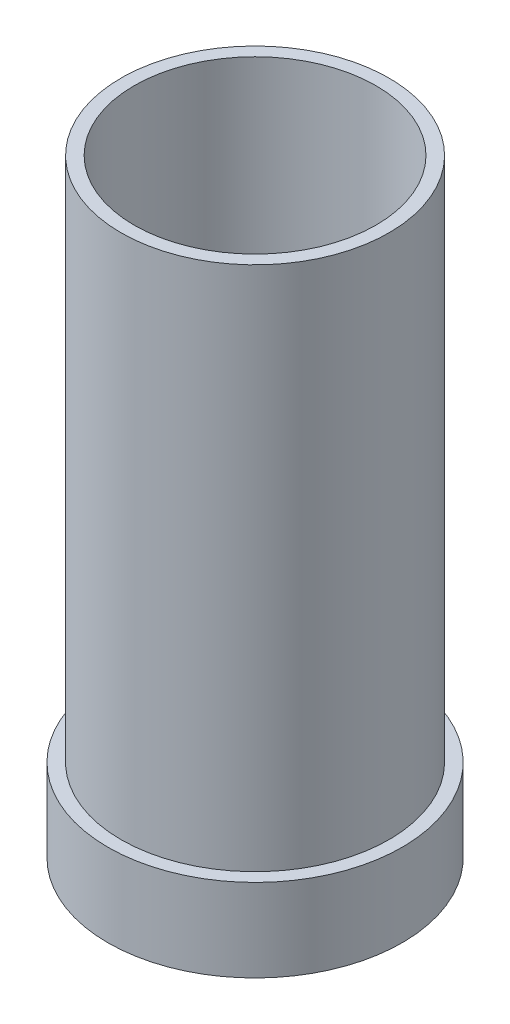
ISO-10303-21;
HEADER;
FILE_DESCRIPTION(('STEP AP214'),'2;1');
FILE_NAME('part.step','',(''),(''),'','','');
FILE_SCHEMA(('AUTOMOTIVE_DESIGN { 1 0 10303 214 1 1 1 1 }'));
ENDSEC;
DATA;
#1=APPLICATION_CONTEXT('core data for automotive mechanical design processes');
#2=APPLICATION_PROTOCOL_DEFINITION('international standard','automotive_design',2000,#1);
#3=PRODUCT_CONTEXT('',#1,'mechanical');
#4=PRODUCT('Part','Part','',(#3));
#5=PRODUCT_RELATED_PRODUCT_CATEGORY('part','',(#4));
#6=PRODUCT_DEFINITION_FORMATION('','',#4);
#7=PRODUCT_DEFINITION_CONTEXT('part definition',#1,'design');
#8=PRODUCT_DEFINITION('design','',#6,#7);
#9=PRODUCT_DEFINITION_SHAPE('','',#8);
#10=(LENGTH_UNIT() NAMED_UNIT(*) SI_UNIT(.MILLI.,.METRE.));
#11=(NAMED_UNIT(*) PLANE_ANGLE_UNIT() SI_UNIT($,.RADIAN.));
#12=(NAMED_UNIT(*) SI_UNIT($,.STERADIAN.) SOLID_ANGLE_UNIT());
#13=UNCERTAINTY_MEASURE_WITH_UNIT(LENGTH_MEASURE(1.E-05),#10,'distance_accuracy_value','');
#14=(GEOMETRIC_REPRESENTATION_CONTEXT(3) GLOBAL_UNCERTAINTY_ASSIGNED_CONTEXT((#13)) GLOBAL_UNIT_ASSIGNED_CONTEXT((#10,
#11,#12)) REPRESENTATION_CONTEXT('',''));
#15=CARTESIAN_POINT('',(0.,0.,0.));
#16=DIRECTION('',(0.,0.,1.));
#17=DIRECTION('',(1.,0.,0.));
#18=AXIS2_PLACEMENT_3D('',#15,#16,#17);
#19=CARTESIAN_POINT('',(0.,2.,0.));
#20=DIRECTION('',(0.,-1.,0.));
#21=DIRECTION('',(0.,0.,-1.));
#22=AXIS2_PLACEMENT_3D('',#19,#20,#21);
#23=CYLINDRICAL_SURFACE('',#22,3.556);
#24=CARTESIAN_POINT('',(0.,2.,0.));
#25=DIRECTION('',(0.,1.,0.));
#26=DIRECTION('',(0.,0.,1.));
#27=AXIS2_PLACEMENT_3D('',#24,#25,#26);
#28=CIRCLE('',#27,3.556);
#29=CARTESIAN_POINT('',(0.,2.,3.556));
#30=VERTEX_POINT('',#29);
#31=EDGE_CURVE('E45',#30,#30,#28,.T.);
#32=ORIENTED_EDGE('',*,*,#31,.F.);
#33=EDGE_LOOP('',(#32));
#34=FACE_BOUND('',#33,.T.);
#35=CARTESIAN_POINT('',(0.,0.,0.));
#36=DIRECTION('',(0.,1.,0.));
#37=DIRECTION('',(0.,0.,1.));
#38=AXIS2_PLACEMENT_3D('',#35,#36,#37);
#39=CIRCLE('',#38,3.556);
#40=CARTESIAN_POINT('',(0.,0.,3.556));
#41=VERTEX_POINT('',#40);
#42=EDGE_CURVE('E40',#41,#41,#39,.T.);
#43=ORIENTED_EDGE('',*,*,#42,.T.);
#44=EDGE_LOOP('',(#43));
#45=FACE_BOUND('',#44,.T.);
#46=ADVANCED_FACE('F37',(#34,#45),#23,.T.);
#47=CARTESIAN_POINT('',(0.,2.,0.));
#48=DIRECTION('',(0.,1.,0.));
#49=DIRECTION('',(0.,0.,1.));
#50=AXIS2_PLACEMENT_3D('',#47,#48,#49);
#51=PLANE('',#50);
#52=CARTESIAN_POINT('',(0.,2.,0.));
#53=DIRECTION('',(0.,1.,0.));
#54=DIRECTION('',(0.,0.,1.));
#55=AXIS2_PLACEMENT_3D('',#52,#53,#54);
#56=CIRCLE('',#55,3.2385);
#57=CARTESIAN_POINT('',(0.,2.,3.2385));
#58=VERTEX_POINT('',#57);
#59=EDGE_CURVE('E10',#58,#58,#56,.T.);
#60=ORIENTED_EDGE('',*,*,#59,.F.);
#61=EDGE_LOOP('',(#60));
#62=FACE_BOUND('',#61,.T.);
#63=ORIENTED_EDGE('',*,*,#31,.T.);
#64=EDGE_LOOP('',(#63));
#65=FACE_BOUND('',#64,.T.);
#66=ADVANCED_FACE('F86',(#62,#65),#51,.T.);
#67=CARTESIAN_POINT('',(0.,0.,0.));
#68=DIRECTION('',(0.,1.,0.));
#69=DIRECTION('',(0.,0.,1.));
#70=AXIS2_PLACEMENT_3D('',#67,#68,#69);
#71=PLANE('',#70);
#72=ORIENTED_EDGE('',*,*,#42,.F.);
#73=EDGE_LOOP('',(#72));
#74=FACE_BOUND('',#73,.T.);
#75=ADVANCED_FACE('F81',(#74),#71,.F.);
#76=CARTESIAN_POINT('',(0.,14.7,0.));
#77=DIRECTION('',(0.,-1.,0.));
#78=DIRECTION('',(0.,0.,-1.));
#79=AXIS2_PLACEMENT_3D('',#76,#77,#78);
#80=CYLINDRICAL_SURFACE('',#79,3.2385);
#81=CARTESIAN_POINT('',(0.,14.7,0.));
#82=DIRECTION('',(0.,1.,0.));
#83=DIRECTION('',(0.,0.,1.));
#84=AXIS2_PLACEMENT_3D('',#81,#82,#83);
#85=CIRCLE('',#84,3.2385);
#86=CARTESIAN_POINT('',(0.,14.7,3.2385));
#87=VERTEX_POINT('',#86);
#88=EDGE_CURVE('E52',#87,#87,#85,.T.);
#89=ORIENTED_EDGE('',*,*,#88,.F.);
#90=EDGE_LOOP('',(#89));
#91=FACE_BOUND('',#90,.T.);
#92=ORIENTED_EDGE('',*,*,#59,.T.);
#93=EDGE_LOOP('',(#92));
#94=FACE_BOUND('',#93,.T.);
#95=ADVANCED_FACE('F76',(#91,#94),#80,.T.);
#96=CARTESIAN_POINT('',(0.,14.7,0.));
#97=DIRECTION('',(0.,1.,0.));
#98=DIRECTION('',(0.,0.,1.));
#99=AXIS2_PLACEMENT_3D('',#96,#97,#98);
#100=PLANE('',#99);
#101=CARTESIAN_POINT('',(0.,14.7,0.));
#102=DIRECTION('',(0.,1.,0.));
#103=DIRECTION('',(0.,0.,1.));
#104=AXIS2_PLACEMENT_3D('',#101,#102,#103);
#105=CIRCLE('',#104,2.921);
#106=CARTESIAN_POINT('',(0.,14.7,2.921));
#107=VERTEX_POINT('',#106);
#108=EDGE_CURVE('E57',#107,#107,#105,.T.);
#109=ORIENTED_EDGE('',*,*,#108,.F.);
#110=EDGE_LOOP('',(#109));
#111=FACE_BOUND('',#110,.T.);
#112=ORIENTED_EDGE('',*,*,#88,.T.);
#113=EDGE_LOOP('',(#112));
#114=FACE_BOUND('',#113,.T.);
#115=ADVANCED_FACE('F70',(#111,#114),#100,.T.);
#116=CARTESIAN_POINT('',(0.,2.,0.));
#117=DIRECTION('',(0.,1.,0.));
#118=DIRECTION('',(0.,0.,1.));
#119=AXIS2_PLACEMENT_3D('',#116,#117,#118);
#120=CYLINDRICAL_SURFACE('',#119,2.921);
#121=CARTESIAN_POINT('',(0.,2.,0.));
#122=DIRECTION('',(0.,1.,0.));
#123=DIRECTION('',(0.,0.,1.));
#124=AXIS2_PLACEMENT_3D('',#121,#122,#123);
#125=CIRCLE('',#124,2.921);
#126=CARTESIAN_POINT('',(0.,2.,2.921));
#127=VERTEX_POINT('',#126);
#128=EDGE_CURVE('E56',#127,#127,#125,.T.);
#129=ORIENTED_EDGE('',*,*,#128,.F.);
#130=EDGE_LOOP('',(#129));
#131=FACE_BOUND('',#130,.T.);
#132=ORIENTED_EDGE('',*,*,#108,.T.);
#133=EDGE_LOOP('',(#132));
#134=FACE_BOUND('',#133,.T.);
#135=ADVANCED_FACE('F67',(#131,#134),#120,.F.);
#136=CARTESIAN_POINT('',(0.,2.,0.));
#137=DIRECTION('',(0.,1.,0.));
#138=DIRECTION('',(0.,0.,1.));
#139=AXIS2_PLACEMENT_3D('',#136,#137,#138);
#140=PLANE('',#139);
#141=ORIENTED_EDGE('',*,*,#128,.T.);
#142=EDGE_LOOP('',(#141));
#143=FACE_BOUND('',#142,.T.);
#144=ADVANCED_FACE('F65',(#143),#140,.T.);
#145=CLOSED_SHELL('',(#46,#66,#75,#95,#115,#135,#144));
#146=MANIFOLD_SOLID_BREP('B2',#145);
#147=ADVANCED_BREP_SHAPE_REPRESENTATION('',(#18,#146),#14);
#148=SHAPE_DEFINITION_REPRESENTATION(#9,#147);
ENDSEC;
END-ISO-10303-21;
